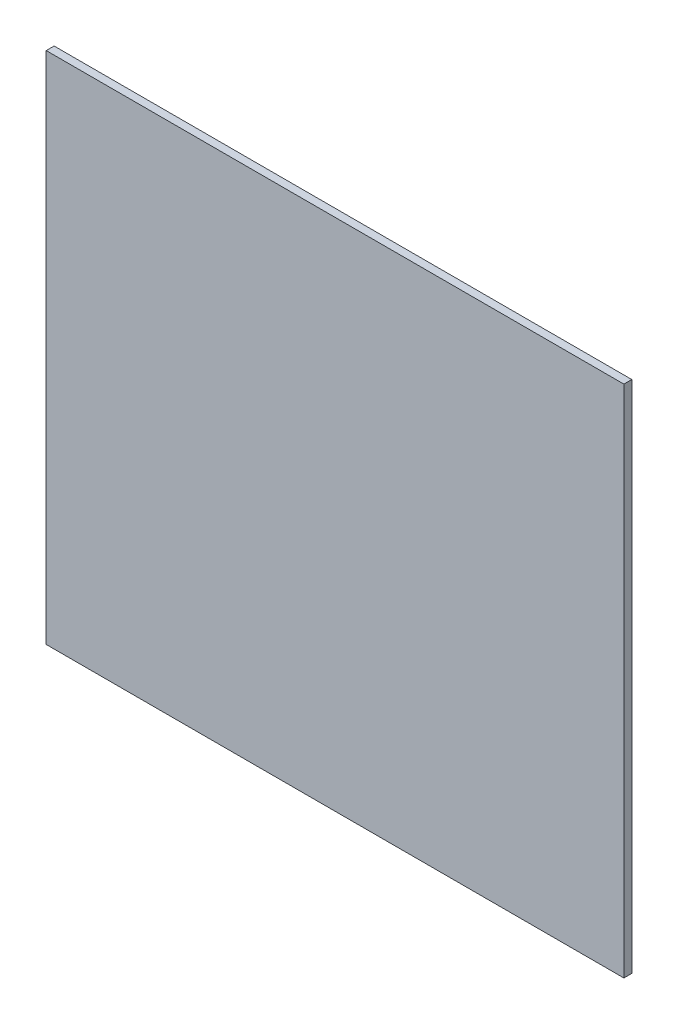
ISO-10303-21;
HEADER;
FILE_DESCRIPTION(('STEP AP214'),'2;1');
FILE_NAME('part.step','',(''),(''),'','','');
FILE_SCHEMA(('AUTOMOTIVE_DESIGN { 1 0 10303 214 1 1 1 1 }'));
ENDSEC;
DATA;
#1=APPLICATION_CONTEXT('core data for automotive mechanical design processes');
#2=APPLICATION_PROTOCOL_DEFINITION('international standard','automotive_design',2000,#1);
#3=PRODUCT_CONTEXT('',#1,'mechanical');
#4=PRODUCT('Part','Part','',(#3));
#5=PRODUCT_RELATED_PRODUCT_CATEGORY('part','',(#4));
#6=PRODUCT_DEFINITION_FORMATION('','',#4);
#7=PRODUCT_DEFINITION_CONTEXT('part definition',#1,'design');
#8=PRODUCT_DEFINITION('design','',#6,#7);
#9=PRODUCT_DEFINITION_SHAPE('','',#8);
#10=(LENGTH_UNIT() NAMED_UNIT(*) SI_UNIT(.MILLI.,.METRE.));
#11=(NAMED_UNIT(*) PLANE_ANGLE_UNIT() SI_UNIT($,.RADIAN.));
#12=(NAMED_UNIT(*) SI_UNIT($,.STERADIAN.) SOLID_ANGLE_UNIT());
#13=UNCERTAINTY_MEASURE_WITH_UNIT(LENGTH_MEASURE(1.E-05),#10,'distance_accuracy_value','');
#14=(GEOMETRIC_REPRESENTATION_CONTEXT(3) GLOBAL_UNCERTAINTY_ASSIGNED_CONTEXT((#13)) GLOBAL_UNIT_ASSIGNED_CONTEXT((#10,
#11,#12)) REPRESENTATION_CONTEXT('',''));
#15=CARTESIAN_POINT('',(0.,0.,0.));
#16=DIRECTION('',(0.,0.,1.));
#17=DIRECTION('',(1.,0.,0.));
#18=AXIS2_PLACEMENT_3D('',#15,#16,#17);
#19=CARTESIAN_POINT('',(0.,0.,0.));
#20=DIRECTION('',(0.,0.,1.));
#21=DIRECTION('',(1.,0.,0.));
#22=AXIS2_PLACEMENT_3D('',#19,#20,#21);
#23=PLANE('',#22);
#24=DIRECTION('',(1.,0.,0.));
#25=VECTOR('',#24,1.);
#26=CARTESIAN_POINT('',(3.65,3.25,0.));
#27=LINE('',#26,#25);
#28=CARTESIAN_POINT('',(3.65,3.25,0.));
#29=VERTEX_POINT('',#28);
#30=CARTESIAN_POINT('',(-3.65,3.25,0.));
#31=VERTEX_POINT('',#30);
#32=EDGE_CURVE('E78',#29,#31,#27,.F.);
#33=ORIENTED_EDGE('',*,*,#32,.F.);
#34=DIRECTION('',(0.,1.,0.));
#35=VECTOR('',#34,1.);
#36=CARTESIAN_POINT('',(3.65,-3.25,0.));
#37=LINE('',#36,#35);
#38=CARTESIAN_POINT('',(3.65,-3.25,0.));
#39=VERTEX_POINT('',#38);
#40=EDGE_CURVE('E54',#39,#29,#37,.T.);
#41=ORIENTED_EDGE('',*,*,#40,.F.);
#42=DIRECTION('',(1.,0.,0.));
#43=VECTOR('',#42,1.);
#44=CARTESIAN_POINT('',(-3.65,-3.25,0.));
#45=LINE('',#44,#43);
#46=CARTESIAN_POINT('',(-3.65,-3.25,0.));
#47=VERTEX_POINT('',#46);
#48=EDGE_CURVE('E56',#47,#39,#45,.T.);
#49=ORIENTED_EDGE('',*,*,#48,.F.);
#50=DIRECTION('',(0.,1.,0.));
#51=VECTOR('',#50,1.);
#52=CARTESIAN_POINT('',(-3.65,3.25,0.));
#53=LINE('',#52,#51);
#54=EDGE_CURVE('E19',#31,#47,#53,.F.);
#55=ORIENTED_EDGE('',*,*,#54,.F.);
#56=EDGE_LOOP('',(#33,#41,#49,#55));
#57=FACE_BOUND('',#56,.T.);
#58=ADVANCED_FACE('F16',(#57),#23,.F.);
#59=CARTESIAN_POINT('',(-3.65,3.25,0.));
#60=DIRECTION('',(-1.,0.,0.));
#61=DIRECTION('',(0.,0.,1.));
#62=AXIS2_PLACEMENT_3D('',#59,#60,#61);
#63=PLANE('',#62);
#64=DIRECTION('',(0.,1.,0.));
#65=VECTOR('',#64,1.);
#66=CARTESIAN_POINT('',(-3.65,0.,0.1));
#67=LINE('',#66,#65);
#68=CARTESIAN_POINT('',(-3.65,3.25,0.1));
#69=VERTEX_POINT('',#68);
#70=CARTESIAN_POINT('',(-3.65,-3.25,0.1));
#71=VERTEX_POINT('',#70);
#72=EDGE_CURVE('E82',#69,#71,#67,.F.);
#73=ORIENTED_EDGE('',*,*,#72,.F.);
#74=DIRECTION('',(0.,0.,1.));
#75=VECTOR('',#74,1.);
#76=CARTESIAN_POINT('',(-3.65,3.25,0.));
#77=LINE('',#76,#75);
#78=EDGE_CURVE('E67',#31,#69,#77,.T.);
#79=ORIENTED_EDGE('',*,*,#78,.F.);
#80=ORIENTED_EDGE('',*,*,#54,.T.);
#81=DIRECTION('',(0.,0.,-1.));
#82=VECTOR('',#81,1.);
#83=CARTESIAN_POINT('',(-3.65,-3.25,0.));
#84=LINE('',#83,#82);
#85=EDGE_CURVE('E62',#71,#47,#84,.T.);
#86=ORIENTED_EDGE('',*,*,#85,.F.);
#87=EDGE_LOOP('',(#73,#79,#80,#86));
#88=FACE_BOUND('',#87,.T.);
#89=ADVANCED_FACE('F64',(#88),#63,.T.);
#90=CARTESIAN_POINT('',(-3.65,-3.25,0.));
#91=DIRECTION('',(0.,-1.,0.));
#92=DIRECTION('',(0.,0.,-1.));
#93=AXIS2_PLACEMENT_3D('',#90,#91,#92);
#94=PLANE('',#93);
#95=DIRECTION('',(1.,0.,0.));
#96=VECTOR('',#95,1.);
#97=CARTESIAN_POINT('',(0.,-3.25,0.1));
#98=LINE('',#97,#96);
#99=CARTESIAN_POINT('',(3.65,-3.25,0.1));
#100=VERTEX_POINT('',#99);
#101=EDGE_CURVE('E71',#71,#100,#98,.T.);
#102=ORIENTED_EDGE('',*,*,#101,.F.);
#103=ORIENTED_EDGE('',*,*,#85,.T.);
#104=ORIENTED_EDGE('',*,*,#48,.T.);
#105=DIRECTION('',(0.,0.,-1.));
#106=VECTOR('',#105,1.);
#107=CARTESIAN_POINT('',(3.65,-3.25,0.));
#108=LINE('',#107,#106);
#109=EDGE_CURVE('E74',#100,#39,#108,.T.);
#110=ORIENTED_EDGE('',*,*,#109,.F.);
#111=EDGE_LOOP('',(#102,#103,#104,#110));
#112=FACE_BOUND('',#111,.T.);
#113=ADVANCED_FACE('F69',(#112),#94,.T.);
#114=CARTESIAN_POINT('',(3.65,-3.25,0.));
#115=DIRECTION('',(1.,0.,0.));
#116=DIRECTION('',(0.,0.,-1.));
#117=AXIS2_PLACEMENT_3D('',#114,#115,#116);
#118=PLANE('',#117);
#119=DIRECTION('',(0.,1.,0.));
#120=VECTOR('',#119,1.);
#121=CARTESIAN_POINT('',(3.65,0.,0.1));
#122=LINE('',#121,#120);
#123=CARTESIAN_POINT('',(3.65,3.25,0.1));
#124=VERTEX_POINT('',#123);
#125=EDGE_CURVE('E25',#100,#124,#122,.T.);
#126=ORIENTED_EDGE('',*,*,#125,.F.);
#127=ORIENTED_EDGE('',*,*,#109,.T.);
#128=ORIENTED_EDGE('',*,*,#40,.T.);
#129=DIRECTION('',(0.,0.,1.));
#130=VECTOR('',#129,1.);
#131=CARTESIAN_POINT('',(3.65,3.25,0.));
#132=LINE('',#131,#130);
#133=EDGE_CURVE('E34',#124,#29,#132,.F.);
#134=ORIENTED_EDGE('',*,*,#133,.F.);
#135=EDGE_LOOP('',(#126,#127,#128,#134));
#136=FACE_BOUND('',#135,.T.);
#137=ADVANCED_FACE('F88',(#136),#118,.T.);
#138=CARTESIAN_POINT('',(3.65,3.25,0.));
#139=DIRECTION('',(0.,1.,0.));
#140=DIRECTION('',(0.,0.,1.));
#141=AXIS2_PLACEMENT_3D('',#138,#139,#140);
#142=PLANE('',#141);
#143=DIRECTION('',(1.,0.,0.));
#144=VECTOR('',#143,1.);
#145=CARTESIAN_POINT('',(0.,3.25,0.1));
#146=LINE('',#145,#144);
#147=EDGE_CURVE('E11',#124,#69,#146,.F.);
#148=ORIENTED_EDGE('',*,*,#147,.F.);
#149=ORIENTED_EDGE('',*,*,#133,.T.);
#150=ORIENTED_EDGE('',*,*,#32,.T.);
#151=ORIENTED_EDGE('',*,*,#78,.T.);
#152=EDGE_LOOP('',(#148,#149,#150,#151));
#153=FACE_BOUND('',#152,.T.);
#154=ADVANCED_FACE('F90',(#153),#142,.T.);
#155=CARTESIAN_POINT('',(0.,0.,0.1));
#156=DIRECTION('',(0.,0.,1.));
#157=DIRECTION('',(1.,0.,0.));
#158=AXIS2_PLACEMENT_3D('',#155,#156,#157);
#159=PLANE('',#158);
#160=ORIENTED_EDGE('',*,*,#125,.T.);
#161=ORIENTED_EDGE('',*,*,#147,.T.);
#162=ORIENTED_EDGE('',*,*,#72,.T.);
#163=ORIENTED_EDGE('',*,*,#101,.T.);
#164=EDGE_LOOP('',(#160,#161,#162,#163));
#165=FACE_BOUND('',#164,.T.);
#166=ADVANCED_FACE('F87',(#165),#159,.T.);
#167=CLOSED_SHELL('',(#58,#89,#113,#137,#154,#166));
#168=MANIFOLD_SOLID_BREP('B1',#167);
#169=ADVANCED_BREP_SHAPE_REPRESENTATION('',(#18,#168),#14);
#170=SHAPE_DEFINITION_REPRESENTATION(#9,#169);
ENDSEC;
END-ISO-10303-21;
